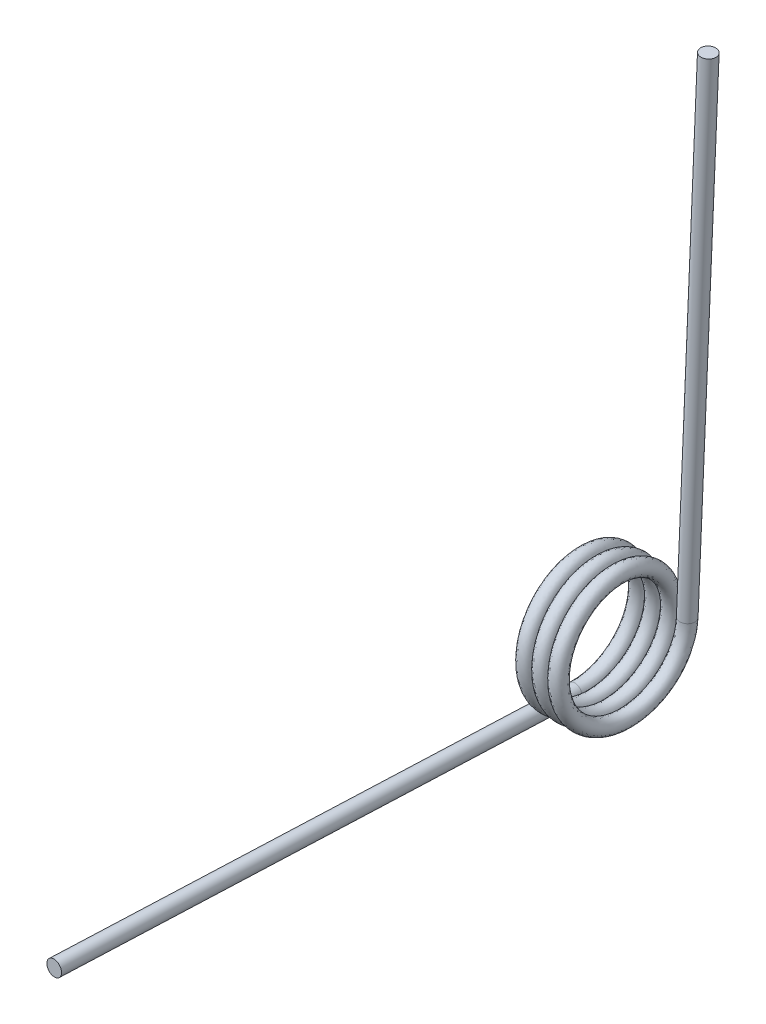
ISO-10303-21;
HEADER;
FILE_DESCRIPTION(('STEP AP214'),'2;1');
FILE_NAME('part.step','',(''),(''),'','','');
FILE_SCHEMA(('AUTOMOTIVE_DESIGN { 1 0 10303 214 1 1 1 1 }'));
ENDSEC;
DATA;
#1=APPLICATION_CONTEXT('core data for automotive mechanical design processes');
#2=APPLICATION_PROTOCOL_DEFINITION('international standard','automotive_design',2000,#1);
#3=PRODUCT_CONTEXT('',#1,'mechanical');
#4=PRODUCT('Part','Part','',(#3));
#5=PRODUCT_RELATED_PRODUCT_CATEGORY('part','',(#4));
#6=PRODUCT_DEFINITION_FORMATION('','',#4);
#7=PRODUCT_DEFINITION_CONTEXT('part definition',#1,'design');
#8=PRODUCT_DEFINITION('design','',#6,#7);
#9=PRODUCT_DEFINITION_SHAPE('','',#8);
#10=(LENGTH_UNIT() NAMED_UNIT(*) SI_UNIT(.MILLI.,.METRE.));
#11=(NAMED_UNIT(*) PLANE_ANGLE_UNIT() SI_UNIT($,.RADIAN.));
#12=(NAMED_UNIT(*) SI_UNIT($,.STERADIAN.) SOLID_ANGLE_UNIT());
#13=UNCERTAINTY_MEASURE_WITH_UNIT(LENGTH_MEASURE(1.E-05),#10,'distance_accuracy_value','');
#14=(GEOMETRIC_REPRESENTATION_CONTEXT(3) GLOBAL_UNCERTAINTY_ASSIGNED_CONTEXT((#13)) GLOBAL_UNIT_ASSIGNED_CONTEXT((#10,
#11,#12)) REPRESENTATION_CONTEXT('',''));
#15=CARTESIAN_POINT('',(0.,0.,0.));
#16=DIRECTION('',(0.,0.,1.));
#17=DIRECTION('',(1.,0.,0.));
#18=AXIS2_PLACEMENT_3D('',#15,#16,#17);
#19=CARTESIAN_POINT('',(-0.291840171145804,-2.2987,-0.0123176501650555));
#20=CARTESIAN_POINT('',(-0.241040171145804,-2.29158840136142,-1.33947271395125));
#21=CARTESIAN_POINT('',(-0.190240171145804,-1.13868260204213,-1.99689142076182));
#22=CARTESIAN_POINT('',(-0.139440171145804,0.0142231972771567,-2.65431012757239));
#23=CARTESIAN_POINT('',(-0.088640171145804,1.16001739795787,-1.98457377059676));
#24=CARTESIAN_POINT('',(-0.0378401711458041,2.30581159863858,-1.31483741362114));
#25=CARTESIAN_POINT('',(0.0129598288541958,2.2987,0.0123176501650552));
#26=CARTESIAN_POINT('',(0.0637598288541957,2.29158840136142,1.33947271395125));
#27=CARTESIAN_POINT('',(0.114559828854196,1.13868260204213,1.99689142076182));
#28=CARTESIAN_POINT('',(0.165359828854195,-0.0142231972771564,2.65431012757239));
#29=CARTESIAN_POINT('',(0.216159828854195,-1.16001739795787,1.98457377059676));
#30=CARTESIAN_POINT('',(0.266959828854195,-2.30581159863858,1.31483741362114));
#31=CARTESIAN_POINT('',(0.317759828854195,-2.2987,-0.0123176501650555));
#32=CARTESIAN_POINT('',(0.368559828854195,-2.29158840136142,-1.33947271395125));
#33=CARTESIAN_POINT('',(0.419359828854195,-1.13868260204213,-1.99689142076182));
#34=CARTESIAN_POINT('',(0.470159828854195,0.0142231972771567,-2.65431012757239));
#35=CARTESIAN_POINT('',(0.520959828854195,1.16001739795787,-1.98457377059676));
#36=CARTESIAN_POINT('',(0.571759828854195,2.30581159863858,-1.31483741362114));
#37=CARTESIAN_POINT('',(0.622559828854194,2.2987,0.0123176501650552));
#38=CARTESIAN_POINT('',(0.673359828854194,2.29158840136142,1.33947271395125));
#39=CARTESIAN_POINT('',(0.724159828854194,1.13868260204213,1.99689142076182));
#40=CARTESIAN_POINT('',(0.774959828854194,-0.0142231972771564,2.65431012757239));
#41=CARTESIAN_POINT('',(0.825759828854194,-1.16001739795787,1.98457377059676));
#42=CARTESIAN_POINT('',(0.876559828854194,-2.30581159863858,1.31483741362114));
#43=CARTESIAN_POINT('',(0.927359828854194,-2.2987,-0.0123176501650555));
#44=CARTESIAN_POINT('',(0.978159828854194,-2.29158840136142,-1.33947271395125));
#45=CARTESIAN_POINT('',(1.02895982885419,-1.13868260204213,-1.99689142076182));
#46=CARTESIAN_POINT('',(1.07975982885419,0.0142231972771567,-2.65431012757239));
#47=CARTESIAN_POINT('',(1.13055982885419,1.16001739795787,-1.98457377059676));
#48=CARTESIAN_POINT('',(1.18135982885419,2.30581159863858,-1.31483741362114));
#49=CARTESIAN_POINT('',(1.23215982885419,2.2987,0.0123176501650552));
#50=CARTESIAN_POINT('',(1.28295982885419,2.29158840136142,1.33947271395125));
#51=CARTESIAN_POINT('',(1.33375982885419,1.13868260204213,1.99689142076182));
#52=CARTESIAN_POINT('',(1.38455982885419,-0.0142231972771564,2.65431012757239));
#53=CARTESIAN_POINT('',(1.43535982885419,-1.16001739795787,1.98457377059676));
#54=CARTESIAN_POINT('',(1.48615982885419,-2.30581159863858,1.31483741362114));
#55=CARTESIAN_POINT('',(1.53695982885419,-2.2987,-0.0123176501650555));
#56=CARTESIAN_POINT('',(1.58775982885419,-2.29158840136142,-1.33947271395125));
#57=CARTESIAN_POINT('',(1.63855982885419,-1.13868260204213,-1.99689142076182));
#58=CARTESIAN_POINT('',(1.68935982885419,0.0142231972771567,-2.65431012757239));
#59=CARTESIAN_POINT('',(1.74015982885419,1.16001739795787,-1.98457377059676));
#60=CARTESIAN_POINT('',(1.79095982885419,2.30581159863858,-1.31483741362114));
#61=CARTESIAN_POINT('',(1.84175982885419,2.2987,0.0123176501650552));
#62=CARTESIAN_POINT('',(1.89255982885419,2.29158840136142,1.33947271395125));
#63=CARTESIAN_POINT('',(1.94335982885419,1.13868260204213,1.99689142076182));
#64=CARTESIAN_POINT('',(1.99415982885419,-0.0142231972771564,2.65431012757239));
#65=CARTESIAN_POINT('',(2.04495982885419,-1.16001739795787,1.98457377059676));
#66=CARTESIAN_POINT('',(2.09575982885419,-2.30581159863858,1.31483741362114));
#67=CARTESIAN_POINT('',(2.14655982885419,-2.2987,-0.0123176501650555));
#68=CARTESIAN_POINT('',(-0.291840171145804,-1.7145,-0.0123176501650488));
#69=CARTESIAN_POINT('',(-0.241040171145804,-1.70738840136143,-1.00218468669066));
#70=CARTESIAN_POINT('',(-0.190240171145804,-0.846582602042139,-1.49095937987094));
#71=CARTESIAN_POINT('',(-0.139440171145804,0.0142231972771491,-1.97973407305123));
#72=CARTESIAN_POINT('',(-0.0886401711458042,0.867917397957862,-1.4786417297059));
#73=CARTESIAN_POINT('',(-0.0378401711458044,1.72161159863857,-0.977549386360565));
#74=CARTESIAN_POINT('',(0.0129598288541955,1.7145,0.0123176501650486));
#75=CARTESIAN_POINT('',(0.0637598288541954,1.70738840136143,1.00218468669066));
#76=CARTESIAN_POINT('',(0.114559828854195,0.846582602042139,1.49095937987094));
#77=CARTESIAN_POINT('',(0.165359828854195,-0.0142231972771488,1.97973407305123));
#78=CARTESIAN_POINT('',(0.216159828854195,-0.867917397957861,1.4786417297059));
#79=CARTESIAN_POINT('',(0.266959828854195,-1.72161159863857,0.977549386360566));
#80=CARTESIAN_POINT('',(0.317759828854195,-1.7145,-0.0123176501650488));
#81=CARTESIAN_POINT('',(0.368559828854195,-1.70738840136143,-1.00218468669066));
#82=CARTESIAN_POINT('',(0.419359828854195,-0.846582602042139,-1.49095937987094));
#83=CARTESIAN_POINT('',(0.470159828854194,0.0142231972771491,-1.97973407305123));
#84=CARTESIAN_POINT('',(0.520959828854194,0.867917397957862,-1.4786417297059));
#85=CARTESIAN_POINT('',(0.571759828854194,1.72161159863857,-0.977549386360565));
#86=CARTESIAN_POINT('',(0.622559828854194,1.7145,0.0123176501650486));
#87=CARTESIAN_POINT('',(0.673359828854194,1.70738840136143,1.00218468669066));
#88=CARTESIAN_POINT('',(0.724159828854194,0.846582602042139,1.49095937987094));
#89=CARTESIAN_POINT('',(0.774959828854194,-0.0142231972771488,1.97973407305123));
#90=CARTESIAN_POINT('',(0.825759828854194,-0.867917397957861,1.4786417297059));
#91=CARTESIAN_POINT('',(0.876559828854193,-1.72161159863857,0.977549386360566));
#92=CARTESIAN_POINT('',(0.927359828854194,-1.7145,-0.0123176501650488));
#93=CARTESIAN_POINT('',(0.978159828854193,-1.70738840136143,-1.00218468669066));
#94=CARTESIAN_POINT('',(1.02895982885419,-0.846582602042139,-1.49095937987094));
#95=CARTESIAN_POINT('',(1.07975982885419,0.0142231972771491,-1.97973407305123));
#96=CARTESIAN_POINT('',(1.13055982885419,0.867917397957862,-1.4786417297059));
#97=CARTESIAN_POINT('',(1.18135982885419,1.72161159863857,-0.977549386360565));
#98=CARTESIAN_POINT('',(1.23215982885419,1.7145,0.0123176501650486));
#99=CARTESIAN_POINT('',(1.28295982885419,1.70738840136143,1.00218468669066));
#100=CARTESIAN_POINT('',(1.33375982885419,0.846582602042139,1.49095937987094));
#101=CARTESIAN_POINT('',(1.38455982885419,-0.0142231972771488,1.97973407305123));
#102=CARTESIAN_POINT('',(1.43535982885419,-0.867917397957861,1.4786417297059));
#103=CARTESIAN_POINT('',(1.48615982885419,-1.72161159863857,0.977549386360566));
#104=CARTESIAN_POINT('',(1.53695982885419,-1.7145,-0.0123176501650488));
#105=CARTESIAN_POINT('',(1.58775982885419,-1.70738840136143,-1.00218468669066));
#106=CARTESIAN_POINT('',(1.63855982885419,-0.846582602042139,-1.49095937987094));
#107=CARTESIAN_POINT('',(1.68935982885419,0.0142231972771491,-1.97973407305123));
#108=CARTESIAN_POINT('',(1.74015982885419,0.867917397957862,-1.4786417297059));
#109=CARTESIAN_POINT('',(1.79095982885419,1.72161159863857,-0.977549386360565));
#110=CARTESIAN_POINT('',(1.84175982885419,1.7145,0.0123176501650486));
#111=CARTESIAN_POINT('',(1.89255982885419,1.70738840136143,1.00218468669066));
#112=CARTESIAN_POINT('',(1.94335982885419,0.846582602042139,1.49095937987094));
#113=CARTESIAN_POINT('',(1.99415982885419,-0.0142231972771488,1.97973407305123));
#114=CARTESIAN_POINT('',(2.04495982885419,-0.867917397957861,1.4786417297059));
#115=CARTESIAN_POINT('',(2.09575982885419,-1.72161159863857,0.977549386360566));
#116=CARTESIAN_POINT('',(2.14655982885419,-1.7145,-0.0123176501650488));
#117=CARTESIAN_POINT('',(0.291840171145803,-1.7145,0.012317650165014));
#118=CARTESIAN_POINT('',(0.342640171145803,-1.72161159863855,-0.977549386360599));
#119=CARTESIAN_POINT('',(0.393440171145803,-0.867917397957832,-1.47864172970591));
#120=CARTESIAN_POINT('',(0.444240171145803,-0.014223197277109,-1.97973407305123));
#121=CARTESIAN_POINT('',(0.495040171145803,0.846582602042168,-1.49095937987093));
#122=CARTESIAN_POINT('',(0.545840171145803,1.70738840136145,-1.00218468669063));
#123=CARTESIAN_POINT('',(0.596640171145803,1.7145,-0.0123176501650142));
#124=CARTESIAN_POINT('',(0.647440171145803,1.72161159863856,0.977549386360599));
#125=CARTESIAN_POINT('',(0.698240171145802,0.867917397957833,1.47864172970591));
#126=CARTESIAN_POINT('',(0.749040171145802,0.0142231972771093,1.97973407305123));
#127=CARTESIAN_POINT('',(0.799840171145802,-0.846582602042167,1.49095937987093));
#128=CARTESIAN_POINT('',(0.850640171145802,-1.70738840136145,1.00218468669063));
#129=CARTESIAN_POINT('',(0.901440171145802,-1.7145,0.012317650165014));
#130=CARTESIAN_POINT('',(0.952240171145802,-1.72161159863855,-0.977549386360599));
#131=CARTESIAN_POINT('',(1.0030401711458,-0.867917397957832,-1.47864172970591));
#132=CARTESIAN_POINT('',(1.0538401711458,-0.014223197277109,-1.97973407305123));
#133=CARTESIAN_POINT('',(1.1046401711458,0.846582602042168,-1.49095937987093));
#134=CARTESIAN_POINT('',(1.1554401711458,1.70738840136145,-1.00218468669063));
#135=CARTESIAN_POINT('',(1.2062401711458,1.7145,-0.0123176501650142));
#136=CARTESIAN_POINT('',(1.2570401711458,1.72161159863856,0.977549386360599));
#137=CARTESIAN_POINT('',(1.3078401711458,0.867917397957833,1.47864172970591));
#138=CARTESIAN_POINT('',(1.3586401711458,0.0142231972771093,1.97973407305123));
#139=CARTESIAN_POINT('',(1.4094401711458,-0.846582602042167,1.49095937987093));
#140=CARTESIAN_POINT('',(1.4602401711458,-1.70738840136145,1.00218468669063));
#141=CARTESIAN_POINT('',(1.5110401711458,-1.7145,0.012317650165014));
#142=CARTESIAN_POINT('',(1.5618401711458,-1.72161159863855,-0.977549386360599));
#143=CARTESIAN_POINT('',(1.6126401711458,-0.867917397957832,-1.47864172970591));
#144=CARTESIAN_POINT('',(1.6634401711458,-0.014223197277109,-1.97973407305123));
#145=CARTESIAN_POINT('',(1.7142401711458,0.846582602042168,-1.49095937987093));
#146=CARTESIAN_POINT('',(1.7650401711458,1.70738840136145,-1.00218468669063));
#147=CARTESIAN_POINT('',(1.8158401711458,1.7145,-0.0123176501650142));
#148=CARTESIAN_POINT('',(1.8666401711458,1.72161159863856,0.977549386360599));
#149=CARTESIAN_POINT('',(1.9174401711458,0.867917397957833,1.47864172970591));
#150=CARTESIAN_POINT('',(1.9682401711458,0.0142231972771093,1.97973407305123));
#151=CARTESIAN_POINT('',(2.0190401711458,-0.846582602042167,1.49095937987093));
#152=CARTESIAN_POINT('',(2.0698401711458,-1.70738840136145,1.00218468669063));
#153=CARTESIAN_POINT('',(2.1206401711458,-1.7145,0.012317650165014));
#154=CARTESIAN_POINT('',(2.1714401711458,-1.72161159863855,-0.977549386360599));
#155=CARTESIAN_POINT('',(2.2222401711458,-0.867917397957832,-1.47864172970591));
#156=CARTESIAN_POINT('',(2.2730401711458,-0.014223197277109,-1.97973407305123));
#157=CARTESIAN_POINT('',(2.3238401711458,0.846582602042168,-1.49095937987093));
#158=CARTESIAN_POINT('',(2.3746401711458,1.70738840136145,-1.00218468669063));
#159=CARTESIAN_POINT('',(2.4254401711458,1.7145,-0.0123176501650142));
#160=CARTESIAN_POINT('',(2.4762401711458,1.72161159863856,0.977549386360599));
#161=CARTESIAN_POINT('',(2.5270401711458,0.867917397957833,1.47864172970591));
#162=CARTESIAN_POINT('',(2.5778401711458,0.0142231972771093,1.97973407305123));
#163=CARTESIAN_POINT('',(2.6286401711458,-0.846582602042167,1.49095937987093));
#164=CARTESIAN_POINT('',(2.6794401711458,-1.70738840136145,1.00218468669063));
#165=CARTESIAN_POINT('',(2.7302401711458,-1.7145,0.012317650165014));
#166=CARTESIAN_POINT('',(0.291840171145804,-2.2987,0.0123176501650073));
#167=CARTESIAN_POINT('',(0.342640171145803,-2.30581159863855,-1.31483741362119));
#168=CARTESIAN_POINT('',(0.393440171145803,-1.16001739795783,-1.98457377059679));
#169=CARTESIAN_POINT('',(0.444240171145803,-0.0142231972771014,-2.65431012757239));
#170=CARTESIAN_POINT('',(0.495040171145803,1.13868260204217,-1.99689142076179));
#171=CARTESIAN_POINT('',(0.545840171145803,2.29158840136145,-1.3394727139512));
#172=CARTESIAN_POINT('',(0.596640171145803,2.2987,-0.0123176501650076));
#173=CARTESIAN_POINT('',(0.647440171145803,2.30581159863855,1.31483741362118));
#174=CARTESIAN_POINT('',(0.698240171145803,1.16001739795783,1.98457377059678));
#175=CARTESIAN_POINT('',(0.749040171145802,0.0142231972771017,2.65431012757239));
#176=CARTESIAN_POINT('',(0.799840171145802,-1.13868260204217,1.99689142076179));
#177=CARTESIAN_POINT('',(0.850640171145802,-2.29158840136145,1.3394727139512));
#178=CARTESIAN_POINT('',(0.901440171145802,-2.2987,0.0123176501650073));
#179=CARTESIAN_POINT('',(0.952240171145802,-2.30581159863855,-1.31483741362119));
#180=CARTESIAN_POINT('',(1.0030401711458,-1.16001739795783,-1.98457377059679));
#181=CARTESIAN_POINT('',(1.0538401711458,-0.0142231972771014,-2.65431012757239));
#182=CARTESIAN_POINT('',(1.1046401711458,1.13868260204217,-1.99689142076179));
#183=CARTESIAN_POINT('',(1.1554401711458,2.29158840136145,-1.3394727139512));
#184=CARTESIAN_POINT('',(1.2062401711458,2.2987,-0.0123176501650076));
#185=CARTESIAN_POINT('',(1.2570401711458,2.30581159863855,1.31483741362118));
#186=CARTESIAN_POINT('',(1.3078401711458,1.16001739795783,1.98457377059678));
#187=CARTESIAN_POINT('',(1.3586401711458,0.0142231972771017,2.65431012757239));
#188=CARTESIAN_POINT('',(1.4094401711458,-1.13868260204217,1.99689142076179));
#189=CARTESIAN_POINT('',(1.4602401711458,-2.29158840136145,1.3394727139512));
#190=CARTESIAN_POINT('',(1.5110401711458,-2.2987,0.0123176501650073));
#191=CARTESIAN_POINT('',(1.5618401711458,-2.30581159863855,-1.31483741362119));
#192=CARTESIAN_POINT('',(1.6126401711458,-1.16001739795783,-1.98457377059679));
#193=CARTESIAN_POINT('',(1.6634401711458,-0.0142231972771014,-2.65431012757239));
#194=CARTESIAN_POINT('',(1.7142401711458,1.13868260204217,-1.99689142076179));
#195=CARTESIAN_POINT('',(1.7650401711458,2.29158840136145,-1.3394727139512));
#196=CARTESIAN_POINT('',(1.8158401711458,2.2987,-0.0123176501650076));
#197=CARTESIAN_POINT('',(1.8666401711458,2.30581159863855,1.31483741362118));
#198=CARTESIAN_POINT('',(1.9174401711458,1.16001739795783,1.98457377059678));
#199=CARTESIAN_POINT('',(1.9682401711458,0.0142231972771017,2.65431012757239));
#200=CARTESIAN_POINT('',(2.0190401711458,-1.13868260204217,1.99689142076179));
#201=CARTESIAN_POINT('',(2.0698401711458,-2.29158840136145,1.3394727139512));
#202=CARTESIAN_POINT('',(2.1206401711458,-2.2987,0.0123176501650073));
#203=CARTESIAN_POINT('',(2.1714401711458,-2.30581159863855,-1.31483741362119));
#204=CARTESIAN_POINT('',(2.2222401711458,-1.16001739795783,-1.98457377059679));
#205=CARTESIAN_POINT('',(2.2730401711458,-0.0142231972771014,-2.65431012757239));
#206=CARTESIAN_POINT('',(2.3238401711458,1.13868260204217,-1.99689142076179));
#207=CARTESIAN_POINT('',(2.3746401711458,2.29158840136145,-1.3394727139512));
#208=CARTESIAN_POINT('',(2.4254401711458,2.2987,-0.0123176501650076));
#209=CARTESIAN_POINT('',(2.4762401711458,2.30581159863855,1.31483741362118));
#210=CARTESIAN_POINT('',(2.5270401711458,1.16001739795783,1.98457377059678));
#211=CARTESIAN_POINT('',(2.5778401711458,0.0142231972771017,2.65431012757239));
#212=CARTESIAN_POINT('',(2.6286401711458,-1.13868260204217,1.99689142076179));
#213=CARTESIAN_POINT('',(2.6794401711458,-2.29158840136145,1.3394727139512));
#214=CARTESIAN_POINT('',(2.7302401711458,-2.2987,0.0123176501650073));
#215=CARTESIAN_POINT('',(0.291840171145804,-2.8829,0.0123176501650007));
#216=CARTESIAN_POINT('',(0.342640171145804,-2.89001159863855,-1.65212544088177));
#217=CARTESIAN_POINT('',(0.393440171145804,-1.45211739795782,-2.49050581148766));
#218=CARTESIAN_POINT('',(0.444240171145804,-0.0142231972770938,-3.32888618209354));
#219=CARTESIAN_POINT('',(0.495040171145803,1.43078260204218,-2.50282346165266));
#220=CARTESIAN_POINT('',(0.545840171145803,2.87578840136145,-1.67676074121177));
#221=CARTESIAN_POINT('',(0.596640171145803,2.8829,-0.0123176501650011));
#222=CARTESIAN_POINT('',(0.647440171145803,2.89001159863855,1.65212544088177));
#223=CARTESIAN_POINT('',(0.698240171145803,1.45211739795782,2.49050581148766));
#224=CARTESIAN_POINT('',(0.749040171145803,0.0142231972770942,3.32888618209354));
#225=CARTESIAN_POINT('',(0.799840171145803,-1.43078260204218,2.50282346165266));
#226=CARTESIAN_POINT('',(0.850640171145802,-2.87578840136145,1.67676074121177));
#227=CARTESIAN_POINT('',(0.901440171145802,-2.8829,0.0123176501650007));
#228=CARTESIAN_POINT('',(0.952240171145803,-2.89001159863855,-1.65212544088177));
#229=CARTESIAN_POINT('',(1.0030401711458,-1.45211739795782,-2.49050581148766));
#230=CARTESIAN_POINT('',(1.0538401711458,-0.0142231972770938,-3.32888618209354));
#231=CARTESIAN_POINT('',(1.1046401711458,1.43078260204218,-2.50282346165266));
#232=CARTESIAN_POINT('',(1.1554401711458,2.87578840136145,-1.67676074121177));
#233=CARTESIAN_POINT('',(1.2062401711458,2.8829,-0.0123176501650011));
#234=CARTESIAN_POINT('',(1.2570401711458,2.89001159863855,1.65212544088177));
#235=CARTESIAN_POINT('',(1.3078401711458,1.45211739795782,2.49050581148766));
#236=CARTESIAN_POINT('',(1.3586401711458,0.0142231972770942,3.32888618209354));
#237=CARTESIAN_POINT('',(1.4094401711458,-1.43078260204218,2.50282346165266));
#238=CARTESIAN_POINT('',(1.4602401711458,-2.87578840136145,1.67676074121177));
#239=CARTESIAN_POINT('',(1.5110401711458,-2.8829,0.0123176501650007));
#240=CARTESIAN_POINT('',(1.5618401711458,-2.89001159863855,-1.65212544088177));
#241=CARTESIAN_POINT('',(1.6126401711458,-1.45211739795782,-2.49050581148766));
#242=CARTESIAN_POINT('',(1.6634401711458,-0.0142231972770938,-3.32888618209354));
#243=CARTESIAN_POINT('',(1.7142401711458,1.43078260204218,-2.50282346165266));
#244=CARTESIAN_POINT('',(1.7650401711458,2.87578840136145,-1.67676074121177));
#245=CARTESIAN_POINT('',(1.8158401711458,2.8829,-0.0123176501650011));
#246=CARTESIAN_POINT('',(1.8666401711458,2.89001159863855,1.65212544088177));
#247=CARTESIAN_POINT('',(1.9174401711458,1.45211739795782,2.49050581148766));
#248=CARTESIAN_POINT('',(1.9682401711458,0.0142231972770942,3.32888618209354));
#249=CARTESIAN_POINT('',(2.0190401711458,-1.43078260204218,2.50282346165266));
#250=CARTESIAN_POINT('',(2.0698401711458,-2.87578840136145,1.67676074121177));
#251=CARTESIAN_POINT('',(2.1206401711458,-2.8829,0.0123176501650007));
#252=CARTESIAN_POINT('',(2.1714401711458,-2.89001159863855,-1.65212544088177));
#253=CARTESIAN_POINT('',(2.2222401711458,-1.45211739795782,-2.49050581148766));
#254=CARTESIAN_POINT('',(2.2730401711458,-0.0142231972770938,-3.32888618209354));
#255=CARTESIAN_POINT('',(2.3238401711458,1.43078260204218,-2.50282346165266));
#256=CARTESIAN_POINT('',(2.3746401711458,2.87578840136145,-1.67676074121177));
#257=CARTESIAN_POINT('',(2.4254401711458,2.8829,-0.0123176501650011));
#258=CARTESIAN_POINT('',(2.4762401711458,2.89001159863855,1.65212544088177));
#259=CARTESIAN_POINT('',(2.5270401711458,1.45211739795782,2.49050581148766));
#260=CARTESIAN_POINT('',(2.5778401711458,0.0142231972770942,3.32888618209354));
#261=CARTESIAN_POINT('',(2.6286401711458,-1.43078260204218,2.50282346165266));
#262=CARTESIAN_POINT('',(2.6794401711458,-2.87578840136145,1.67676074121177));
#263=CARTESIAN_POINT('',(2.7302401711458,-2.8829,0.0123176501650007));
#264=CARTESIAN_POINT('',(-0.291840171145803,-2.8829,-0.0123176501650621));
#265=CARTESIAN_POINT('',(-0.241040171145803,-2.87578840136142,-1.67676074121183));
#266=CARTESIAN_POINT('',(-0.190240171145803,-1.43078260204213,-2.50282346165269));
#267=CARTESIAN_POINT('',(-0.139440171145804,0.0142231972771643,-3.32888618209354));
#268=CARTESIAN_POINT('',(-0.0886401711458037,1.45211739795787,-2.49050581148763));
#269=CARTESIAN_POINT('',(-0.0378401711458038,2.89001159863858,-1.65212544088171));
#270=CARTESIAN_POINT('',(0.0129598288541961,2.8829,0.0123176501650618));
#271=CARTESIAN_POINT('',(0.0637598288541959,2.87578840136142,1.67676074121183));
#272=CARTESIAN_POINT('',(0.114559828854196,1.43078260204213,2.50282346165269));
#273=CARTESIAN_POINT('',(0.165359828854196,-0.0142231972771639,3.32888618209354));
#274=CARTESIAN_POINT('',(0.216159828854196,-1.45211739795787,2.49050581148763));
#275=CARTESIAN_POINT('',(0.266959828854195,-2.89001159863858,1.65212544088171));
#276=CARTESIAN_POINT('',(0.317759828854195,-2.8829,-0.0123176501650621));
#277=CARTESIAN_POINT('',(0.368559828854195,-2.87578840136142,-1.67676074121183));
#278=CARTESIAN_POINT('',(0.419359828854195,-1.43078260204213,-2.50282346165269));
#279=CARTESIAN_POINT('',(0.470159828854195,0.0142231972771643,-3.32888618209354));
#280=CARTESIAN_POINT('',(0.520959828854195,1.45211739795787,-2.49050581148763));
#281=CARTESIAN_POINT('',(0.571759828854195,2.89001159863858,-1.65212544088171));
#282=CARTESIAN_POINT('',(0.622559828854195,2.8829,0.0123176501650618));
#283=CARTESIAN_POINT('',(0.673359828854194,2.87578840136142,1.67676074121183));
#284=CARTESIAN_POINT('',(0.724159828854194,1.43078260204213,2.50282346165269));
#285=CARTESIAN_POINT('',(0.774959828854194,-0.0142231972771639,3.32888618209354));
#286=CARTESIAN_POINT('',(0.825759828854194,-1.45211739795787,2.49050581148763));
#287=CARTESIAN_POINT('',(0.876559828854194,-2.89001159863858,1.65212544088171));
#288=CARTESIAN_POINT('',(0.927359828854194,-2.8829,-0.0123176501650621));
#289=CARTESIAN_POINT('',(0.978159828854194,-2.87578840136142,-1.67676074121183));
#290=CARTESIAN_POINT('',(1.02895982885419,-1.43078260204213,-2.50282346165269));
#291=CARTESIAN_POINT('',(1.07975982885419,0.0142231972771643,-3.32888618209354));
#292=CARTESIAN_POINT('',(1.13055982885419,1.45211739795787,-2.49050581148763));
#293=CARTESIAN_POINT('',(1.18135982885419,2.89001159863858,-1.65212544088171));
#294=CARTESIAN_POINT('',(1.23215982885419,2.8829,0.0123176501650618));
#295=CARTESIAN_POINT('',(1.28295982885419,2.87578840136142,1.67676074121183));
#296=CARTESIAN_POINT('',(1.33375982885419,1.43078260204213,2.50282346165269));
#297=CARTESIAN_POINT('',(1.38455982885419,-0.0142231972771639,3.32888618209354));
#298=CARTESIAN_POINT('',(1.43535982885419,-1.45211739795787,2.49050581148763));
#299=CARTESIAN_POINT('',(1.48615982885419,-2.89001159863858,1.65212544088171));
#300=CARTESIAN_POINT('',(1.53695982885419,-2.8829,-0.0123176501650621));
#301=CARTESIAN_POINT('',(1.58775982885419,-2.87578840136142,-1.67676074121183));
#302=CARTESIAN_POINT('',(1.63855982885419,-1.43078260204213,-2.50282346165269));
#303=CARTESIAN_POINT('',(1.68935982885419,0.0142231972771643,-3.32888618209354));
#304=CARTESIAN_POINT('',(1.74015982885419,1.45211739795787,-2.49050581148763));
#305=CARTESIAN_POINT('',(1.79095982885419,2.89001159863858,-1.65212544088171));
#306=CARTESIAN_POINT('',(1.84175982885419,2.8829,0.0123176501650618));
#307=CARTESIAN_POINT('',(1.89255982885419,2.87578840136142,1.67676074121183));
#308=CARTESIAN_POINT('',(1.94335982885419,1.43078260204213,2.50282346165269));
#309=CARTESIAN_POINT('',(1.99415982885419,-0.0142231972771639,3.32888618209354));
#310=CARTESIAN_POINT('',(2.04495982885419,-1.45211739795787,2.49050581148763));
#311=CARTESIAN_POINT('',(2.09575982885419,-2.89001159863858,1.65212544088171));
#312=CARTESIAN_POINT('',(2.14655982885419,-2.8829,-0.0123176501650621));
#313=CARTESIAN_POINT('',(-0.291840171145804,-2.2987,-0.0123176501650555));
#314=CARTESIAN_POINT('',(-0.241040171145804,-2.29158840136142,-1.33947271395125));
#315=CARTESIAN_POINT('',(-0.190240171145804,-1.13868260204213,-1.99689142076182));
#316=CARTESIAN_POINT('',(-0.139440171145804,0.0142231972771567,-2.65431012757239));
#317=CARTESIAN_POINT('',(-0.088640171145804,1.16001739795787,-1.98457377059676));
#318=CARTESIAN_POINT('',(-0.0378401711458041,2.30581159863858,-1.31483741362114));
#319=CARTESIAN_POINT('',(0.0129598288541958,2.2987,0.0123176501650552));
#320=CARTESIAN_POINT('',(0.0637598288541957,2.29158840136142,1.33947271395125));
#321=CARTESIAN_POINT('',(0.114559828854196,1.13868260204213,1.99689142076182));
#322=CARTESIAN_POINT('',(0.165359828854195,-0.0142231972771564,2.65431012757239));
#323=CARTESIAN_POINT('',(0.216159828854195,-1.16001739795787,1.98457377059676));
#324=CARTESIAN_POINT('',(0.266959828854195,-2.30581159863858,1.31483741362114));
#325=CARTESIAN_POINT('',(0.317759828854195,-2.2987,-0.0123176501650555));
#326=CARTESIAN_POINT('',(0.368559828854195,-2.29158840136142,-1.33947271395125));
#327=CARTESIAN_POINT('',(0.419359828854195,-1.13868260204213,-1.99689142076182));
#328=CARTESIAN_POINT('',(0.470159828854195,0.0142231972771567,-2.65431012757239));
#329=CARTESIAN_POINT('',(0.520959828854195,1.16001739795787,-1.98457377059676));
#330=CARTESIAN_POINT('',(0.571759828854195,2.30581159863858,-1.31483741362114));
#331=CARTESIAN_POINT('',(0.622559828854194,2.2987,0.0123176501650552));
#332=CARTESIAN_POINT('',(0.673359828854194,2.29158840136142,1.33947271395125));
#333=CARTESIAN_POINT('',(0.724159828854194,1.13868260204213,1.99689142076182));
#334=CARTESIAN_POINT('',(0.774959828854194,-0.0142231972771564,2.65431012757239));
#335=CARTESIAN_POINT('',(0.825759828854194,-1.16001739795787,1.98457377059676));
#336=CARTESIAN_POINT('',(0.876559828854194,-2.30581159863858,1.31483741362114));
#337=CARTESIAN_POINT('',(0.927359828854194,-2.2987,-0.0123176501650555));
#338=CARTESIAN_POINT('',(0.978159828854194,-2.29158840136142,-1.33947271395125));
#339=CARTESIAN_POINT('',(1.02895982885419,-1.13868260204213,-1.99689142076182));
#340=CARTESIAN_POINT('',(1.07975982885419,0.0142231972771567,-2.65431012757239));
#341=CARTESIAN_POINT('',(1.13055982885419,1.16001739795787,-1.98457377059676));
#342=CARTESIAN_POINT('',(1.18135982885419,2.30581159863858,-1.31483741362114));
#343=CARTESIAN_POINT('',(1.23215982885419,2.2987,0.0123176501650552));
#344=CARTESIAN_POINT('',(1.28295982885419,2.29158840136142,1.33947271395125));
#345=CARTESIAN_POINT('',(1.33375982885419,1.13868260204213,1.99689142076182));
#346=CARTESIAN_POINT('',(1.38455982885419,-0.0142231972771564,2.65431012757239));
#347=CARTESIAN_POINT('',(1.43535982885419,-1.16001739795787,1.98457377059676));
#348=CARTESIAN_POINT('',(1.48615982885419,-2.30581159863858,1.31483741362114));
#349=CARTESIAN_POINT('',(1.53695982885419,-2.2987,-0.0123176501650555));
#350=CARTESIAN_POINT('',(1.58775982885419,-2.29158840136142,-1.33947271395125));
#351=CARTESIAN_POINT('',(1.63855982885419,-1.13868260204213,-1.99689142076182));
#352=CARTESIAN_POINT('',(1.68935982885419,0.0142231972771567,-2.65431012757239));
#353=CARTESIAN_POINT('',(1.74015982885419,1.16001739795787,-1.98457377059676));
#354=CARTESIAN_POINT('',(1.79095982885419,2.30581159863858,-1.31483741362114));
#355=CARTESIAN_POINT('',(1.84175982885419,2.2987,0.0123176501650552));
#356=CARTESIAN_POINT('',(1.89255982885419,2.29158840136142,1.33947271395125));
#357=CARTESIAN_POINT('',(1.94335982885419,1.13868260204213,1.99689142076182));
#358=CARTESIAN_POINT('',(1.99415982885419,-0.0142231972771564,2.65431012757239));
#359=CARTESIAN_POINT('',(2.04495982885419,-1.16001739795787,1.98457377059676));
#360=CARTESIAN_POINT('',(2.09575982885419,-2.30581159863858,1.31483741362114));
#361=CARTESIAN_POINT('',(2.14655982885419,-2.2987,-0.0123176501650555));
#362=(BOUNDED_SURFACE() B_SPLINE_SURFACE(3,2,((#19,#20,#21,#22,#23,#24,#25,#26,#27,#28,#29,#30,
#31,#32,#33,#34,#35,#36,#37,#38,#39,#40,#41,#42,#43,#44,#45,#46,#47,#48,#49,#50,#51,#52,#53,#54,
#55,#56,#57,#58,#59,#60,#61,#62,#63,#64,#65,#66,#67),(#68,#69,#70,#71,#72,#73,#74,#75,#76,#77,
#78,#79,#80,#81,#82,#83,#84,#85,#86,#87,#88,#89,#90,#91,#92,#93,#94,#95,#96,#97,#98,#99,#100,
#101,#102,#103,#104,#105,#106,#107,#108,#109,#110,#111,#112,#113,#114,#115,#116),(#117,#118,
#119,#120,#121,#122,#123,#124,#125,#126,#127,#128,#129,#130,#131,#132,#133,#134,#135,#136,#137,
#138,#139,#140,#141,#142,#143,#144,#145,#146,#147,#148,#149,#150,#151,#152,#153,#154,#155,#156,
#157,#158,#159,#160,#161,#162,#163,#164,#165),(#166,#167,#168,#169,#170,#171,#172,#173,#174,
#175,#176,#177,#178,#179,#180,#181,#182,#183,#184,#185,#186,#187,#188,#189,#190,#191,#192,#193,
#194,#195,#196,#197,#198,#199,#200,#201,#202,#203,#204,#205,#206,#207,#208,#209,#210,#211,#212,
#213,#214),(#215,#216,#217,#218,#219,#220,#221,#222,#223,#224,#225,#226,#227,#228,#229,#230,
#231,#232,#233,#234,#235,#236,#237,#238,#239,#240,#241,#242,#243,#244,#245,#246,#247,#248,#249,
#250,#251,#252,#253,#254,#255,#256,#257,#258,#259,#260,#261,#262,#263),(#264,#265,#266,#267,
#268,#269,#270,#271,#272,#273,#274,#275,#276,#277,#278,#279,#280,#281,#282,#283,#284,#285,#286,
#287,#288,#289,#290,#291,#292,#293,#294,#295,#296,#297,#298,#299,#300,#301,#302,#303,#304,#305,
#306,#307,#308,#309,#310,#311,#312),(#313,#314,#315,#316,#317,#318,#319,#320,#321,#322,#323,
#324,#325,#326,#327,#328,#329,#330,#331,#332,#333,#334,#335,#336,#337,#338,#339,#340,#341,#342,
#343,#344,#345,#346,#347,#348,#349,#350,#351,#352,#353,#354,#355,#356,#357,#358,#359,#360,
#361)),.UNSPECIFIED.,.T.,.F.,.F.) B_SPLINE_SURFACE_WITH_KNOTS((4,3,4),(3,2,2,2,2,2,2,2,2,2,2,2,
2,2,2,2,2,2,2,2,2,2,2,2,3),(0.,0.5,1.),(0.,0.0416666666666667,0.0833333333333333,0.125,
0.166666666666667,0.208333333333333,0.25,0.291666666666667,0.333333333333333,0.375,
0.416666666666667,0.458333333333333,0.5,0.541666666666667,0.583333333333333,0.625,
0.666666666666667,0.708333333333333,0.75,0.791666666666667,0.833333333333333,0.875,
0.916666666666667,0.958333333333333,1.),
.UNSPECIFIED.) GEOMETRIC_REPRESENTATION_ITEM() RATIONAL_B_SPLINE_SURFACE(((1.,0.866025403784439,
1.,0.866025403784439,1.,0.866025403784439,1.,0.866025403784439,1.,0.866025403784439,1.,
0.866025403784439,1.,0.866025403784439,1.,0.866025403784439,1.,0.866025403784439,1.,
0.866025403784439,1.,0.866025403784439,1.,0.866025403784439,1.,0.866025403784439,1.,
0.866025403784439,1.,0.866025403784439,1.,0.866025403784439,1.,0.866025403784439,1.,
0.866025403784439,1.,0.866025403784439,1.,0.866025403784439,1.,0.866025403784439,1.,
0.866025403784439,1.,0.866025403784439,1.,0.866025403784439,1.),(0.333333333333333,
0.288675134594813,0.333333333333333,0.288675134594813,0.333333333333333,0.288675134594813,
0.333333333333333,0.288675134594813,0.333333333333333,0.288675134594813,0.333333333333333,
0.288675134594813,0.333333333333333,0.288675134594813,0.333333333333333,0.288675134594813,
0.333333333333333,0.288675134594813,0.333333333333333,0.288675134594813,0.333333333333333,
0.288675134594813,0.333333333333333,0.288675134594813,0.333333333333333,0.288675134594813,
0.333333333333333,0.288675134594813,0.333333333333333,0.288675134594813,0.333333333333333,
0.288675134594813,0.333333333333333,0.288675134594813,0.333333333333333,0.288675134594813,
0.333333333333333,0.288675134594813,0.333333333333333,0.288675134594813,0.333333333333333,
0.288675134594813,0.333333333333333,0.288675134594813,0.333333333333333,0.288675134594813,
0.333333333333333,0.288675134594813,0.333333333333333),(0.333333333333333,0.288675134594813,
0.333333333333333,0.288675134594813,0.333333333333333,0.288675134594813,0.333333333333333,
0.288675134594813,0.333333333333333,0.288675134594813,0.333333333333333,0.288675134594813,
0.333333333333333,0.288675134594813,0.333333333333333,0.288675134594813,0.333333333333333,
0.288675134594813,0.333333333333333,0.288675134594813,0.333333333333333,0.288675134594813,
0.333333333333333,0.288675134594813,0.333333333333333,0.288675134594813,0.333333333333333,
0.288675134594813,0.333333333333333,0.288675134594813,0.333333333333333,0.288675134594813,
0.333333333333333,0.288675134594813,0.333333333333333,0.288675134594813,0.333333333333333,
0.288675134594813,0.333333333333333,0.288675134594813,0.333333333333333,0.288675134594813,
0.333333333333333,0.288675134594813,0.333333333333333,0.288675134594813,0.333333333333333,
0.288675134594813,0.333333333333333),(1.,0.866025403784439,1.,0.866025403784439,1.,
0.866025403784439,1.,0.866025403784439,1.,0.866025403784439,1.,0.866025403784439,1.,
0.866025403784439,1.,0.866025403784439,1.,0.866025403784439,1.,0.866025403784439,1.,
0.866025403784439,1.,0.866025403784439,1.,0.866025403784439,1.,0.866025403784439,1.,
0.866025403784439,1.,0.866025403784439,1.,0.866025403784439,1.,0.866025403784439,1.,
0.866025403784439,1.,0.866025403784439,1.,0.866025403784439,1.,0.866025403784439,1.,
0.866025403784439,1.,0.866025403784439,1.),(0.333333333333333,0.288675134594813,
0.333333333333333,0.288675134594813,0.333333333333333,0.288675134594813,0.333333333333333,
0.288675134594813,0.333333333333333,0.288675134594813,0.333333333333333,0.288675134594813,
0.333333333333333,0.288675134594813,0.333333333333333,0.288675134594813,0.333333333333333,
0.288675134594813,0.333333333333333,0.288675134594813,0.333333333333333,0.288675134594813,
0.333333333333333,0.288675134594813,0.333333333333333,0.288675134594813,0.333333333333333,
0.288675134594813,0.333333333333333,0.288675134594813,0.333333333333333,0.288675134594813,
0.333333333333333,0.288675134594813,0.333333333333333,0.288675134594813,0.333333333333333,
0.288675134594813,0.333333333333333,0.288675134594813,0.333333333333333,0.288675134594813,
0.333333333333333,0.288675134594813,0.333333333333333,0.288675134594813,0.333333333333333,
0.288675134594813,0.333333333333333),(0.333333333333333,0.288675134594813,0.333333333333333,
0.288675134594813,0.333333333333333,0.288675134594813,0.333333333333333,0.288675134594813,
0.333333333333333,0.288675134594813,0.333333333333333,0.288675134594813,0.333333333333333,
0.288675134594813,0.333333333333333,0.288675134594813,0.333333333333333,0.288675134594813,
0.333333333333333,0.288675134594813,0.333333333333333,0.288675134594813,0.333333333333333,
0.288675134594813,0.333333333333333,0.288675134594813,0.333333333333333,0.288675134594813,
0.333333333333333,0.288675134594813,0.333333333333333,0.288675134594813,0.333333333333333,
0.288675134594813,0.333333333333333,0.288675134594813,0.333333333333333,0.288675134594813,
0.333333333333333,0.288675134594813,0.333333333333333,0.288675134594813,0.333333333333333,
0.288675134594813,0.333333333333333,0.288675134594813,0.333333333333333,0.288675134594813,
0.333333333333333),(1.,0.866025403784439,1.,0.866025403784439,1.,0.866025403784439,1.,
0.866025403784439,1.,0.866025403784439,1.,0.866025403784439,1.,0.866025403784439,1.,
0.866025403784439,1.,0.866025403784439,1.,0.866025403784439,1.,0.866025403784439,1.,
0.866025403784439,1.,0.866025403784439,1.,0.866025403784439,1.,0.866025403784439,1.,
0.866025403784439,1.,0.866025403784439,1.,0.866025403784439,1.,0.866025403784439,1.,
0.866025403784439,1.,0.866025403784439,1.,0.866025403784439,1.,0.866025403784439,1.,
0.866025403784439,1.))) REPRESENTATION_ITEM('') SURFACE());
#363=CARTESIAN_POINT('',(1.9812,1.24329117557729E-13,-2.2987));
#364=DIRECTION('',(0.0421692919035652,0.999110479787071,0.));
#365=DIRECTION('',(-0.999110479787071,0.0421692919035652,0.));
#366=AXIS2_PLACEMENT_3D('',#363,#364,#365);
#367=CIRCLE('',#366,0.2921);
#368=CARTESIAN_POINT('',(1.6893598288542,0.0123176501651557,-2.2987));
#369=VERTEX_POINT('',#368);
#370=EDGE_CURVE('E10',#369,#369,#367,.T.);
#371=CARTESIAN_POINT('',(0.,-2.2987,0.));
#372=DIRECTION('',(0.0421692919035652,0.,-0.999110479787071));
#373=DIRECTION('',(-0.999110479787071,0.,-0.0421692919035652));
#374=AXIS2_PLACEMENT_3D('',#371,#372,#373);
#375=CIRCLE('',#374,0.2921);
#376=CARTESIAN_POINT('',(-0.291840171145804,-2.2987,-0.0123176501650555));
#377=VERTEX_POINT('',#376);
#378=EDGE_CURVE('E38',#377,#377,#375,.T.);
#379=ORIENTED_EDGE('',*,*,#370,.F.);
#380=EDGE_LOOP('',(#379));
#381=FACE_BOUND('',#380,.T.);
#382=ORIENTED_EDGE('',*,*,#378,.T.);
#383=EDGE_LOOP('',(#382));
#384=FACE_BOUND('',#383,.T.);
#385=ADVANCED_FACE('F30',(#381,#384),#362,.T.);
#386=CARTESIAN_POINT('',(-0.803325010762918,-2.29870000000022,19.0330546399437));
#387=DIRECTION('',(0.0421692919035652,0.,-0.999110479787071));
#388=DIRECTION('',(-0.999110479787071,0.,-0.0421692919035652));
#389=AXIS2_PLACEMENT_3D('',#386,#387,#388);
#390=CYLINDRICAL_SURFACE('',#389,0.2921);
#391=CARTESIAN_POINT('',(-0.803325010762918,-2.29870000000022,19.0330546399437));
#392=DIRECTION('',(-0.0421692919035652,0.,0.999110479787071));
#393=DIRECTION('',(0.999110479787071,0.,0.0421692919035652));
#394=AXIS2_PLACEMENT_3D('',#391,#392,#393);
#395=CIRCLE('',#394,0.2921);
#396=CARTESIAN_POINT('',(-0.511484839617114,-2.29870000000022,19.0453722901087));
#397=VERTEX_POINT('',#396);
#398=EDGE_CURVE('E42',#397,#397,#395,.T.);
#399=ORIENTED_EDGE('',*,*,#398,.F.);
#400=EDGE_LOOP('',(#399));
#401=FACE_BOUND('',#400,.T.);
#402=ORIENTED_EDGE('',*,*,#378,.F.);
#403=EDGE_LOOP('',(#402));
#404=FACE_BOUND('',#403,.T.);
#405=ADVANCED_FACE('F63',(#401,#404),#390,.T.);
#406=CARTESIAN_POINT('',(-0.803325010762918,-2.29870000000022,19.0330546399437));
#407=DIRECTION('',(-0.0421692919035652,0.,0.999110479787071));
#408=DIRECTION('',(0.999110479787071,0.,0.0421692919035652));
#409=AXIS2_PLACEMENT_3D('',#406,#407,#408);
#410=PLANE('',#409);
#411=ORIENTED_EDGE('',*,*,#398,.T.);
#412=EDGE_LOOP('',(#411));
#413=FACE_BOUND('',#412,.T.);
#414=ADVANCED_FACE('F56',(#413),#410,.T.);
#415=CARTESIAN_POINT('',(2.78452501076292,19.0330546399438,-2.29869999999895));
#416=DIRECTION('',(-0.0421692919035652,-0.999110479787071,0.));
#417=DIRECTION('',(0.999110479787071,-0.0421692919035652,0.));
#418=AXIS2_PLACEMENT_3D('',#415,#416,#417);
#419=CYLINDRICAL_SURFACE('',#418,0.2921);
#420=CARTESIAN_POINT('',(2.78452501076292,19.0330546399438,-2.29869999999895));
#421=DIRECTION('',(0.0421692919035652,0.999110479787071,0.));
#422=DIRECTION('',(-0.999110479787071,0.0421692919035652,0.));
#423=AXIS2_PLACEMENT_3D('',#420,#421,#422);
#424=CIRCLE('',#423,0.2921);
#425=CARTESIAN_POINT('',(2.49268483961711,19.0453722901089,-2.29869999999895));
#426=VERTEX_POINT('',#425);
#427=EDGE_CURVE('E46',#426,#426,#424,.T.);
#428=ORIENTED_EDGE('',*,*,#427,.F.);
#429=EDGE_LOOP('',(#428));
#430=FACE_BOUND('',#429,.T.);
#431=ORIENTED_EDGE('',*,*,#370,.T.);
#432=EDGE_LOOP('',(#431));
#433=FACE_BOUND('',#432,.T.);
#434=ADVANCED_FACE('F54',(#430,#433),#419,.T.);
#435=CARTESIAN_POINT('',(2.78452501076292,19.0330546399438,-2.29869999999895));
#436=DIRECTION('',(0.0421692919035652,0.999110479787071,0.));
#437=DIRECTION('',(-0.999110479787071,0.0421692919035652,0.));
#438=AXIS2_PLACEMENT_3D('',#435,#436,#437);
#439=PLANE('',#438);
#440=ORIENTED_EDGE('',*,*,#427,.T.);
#441=EDGE_LOOP('',(#440));
#442=FACE_BOUND('',#441,.T.);
#443=ADVANCED_FACE('F52',(#442),#439,.T.);
#444=CLOSED_SHELL('',(#385,#405,#414,#434,#443));
#445=MANIFOLD_SOLID_BREP('B2',#444);
#446=ADVANCED_BREP_SHAPE_REPRESENTATION('',(#18,#445),#14);
#447=SHAPE_DEFINITION_REPRESENTATION(#9,#446);
ENDSEC;
END-ISO-10303-21;
